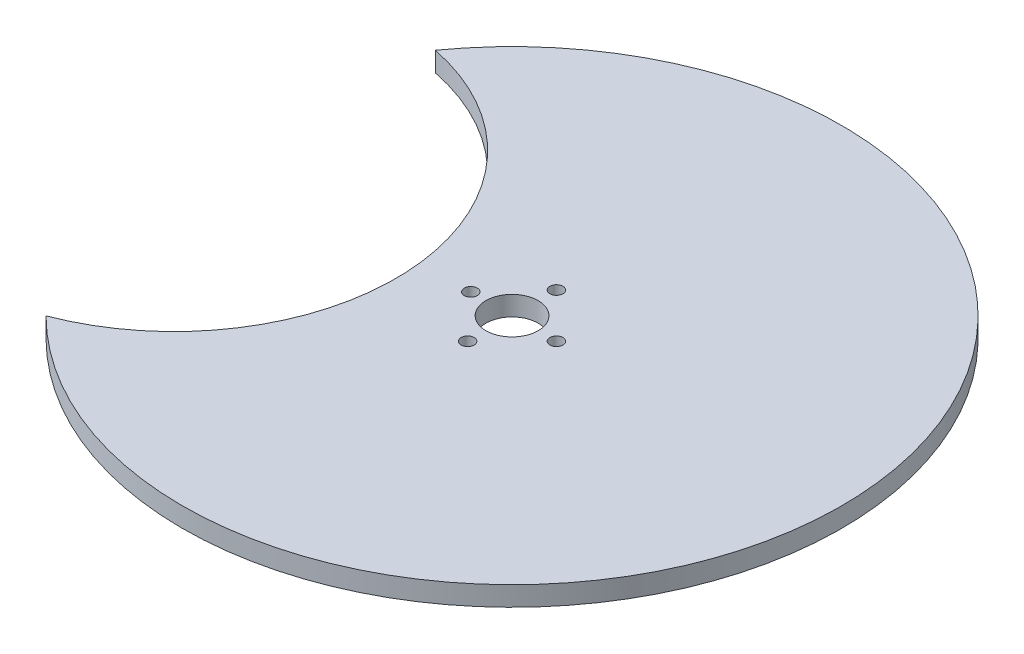
ISO-10303-21;
HEADER;
FILE_DESCRIPTION(('STEP AP214'),'2;1');
FILE_NAME('part.step','',(''),(''),'','','');
FILE_SCHEMA(('AUTOMOTIVE_DESIGN { 1 0 10303 214 1 1 1 1 }'));
ENDSEC;
DATA;
#1=APPLICATION_CONTEXT('core data for automotive mechanical design processes');
#2=APPLICATION_PROTOCOL_DEFINITION('international standard','automotive_design',2000,#1);
#3=PRODUCT_CONTEXT('',#1,'mechanical');
#4=PRODUCT('Part','Part','',(#3));
#5=PRODUCT_RELATED_PRODUCT_CATEGORY('part','',(#4));
#6=PRODUCT_DEFINITION_FORMATION('','',#4);
#7=PRODUCT_DEFINITION_CONTEXT('part definition',#1,'design');
#8=PRODUCT_DEFINITION('design','',#6,#7);
#9=PRODUCT_DEFINITION_SHAPE('','',#8);
#10=(LENGTH_UNIT() NAMED_UNIT(*) SI_UNIT(.MILLI.,.METRE.));
#11=(NAMED_UNIT(*) PLANE_ANGLE_UNIT() SI_UNIT($,.RADIAN.));
#12=(NAMED_UNIT(*) SI_UNIT($,.STERADIAN.) SOLID_ANGLE_UNIT());
#13=UNCERTAINTY_MEASURE_WITH_UNIT(LENGTH_MEASURE(1.E-05),#10,'distance_accuracy_value','');
#14=(GEOMETRIC_REPRESENTATION_CONTEXT(3) GLOBAL_UNCERTAINTY_ASSIGNED_CONTEXT((#13)) GLOBAL_UNIT_ASSIGNED_CONTEXT((#10,
#11,#12)) REPRESENTATION_CONTEXT('',''));
#15=CARTESIAN_POINT('',(0.,0.,0.));
#16=DIRECTION('',(0.,0.,1.));
#17=DIRECTION('',(1.,0.,0.));
#18=AXIS2_PLACEMENT_3D('',#15,#16,#17);
#19=CARTESIAN_POINT('',(-23.9171069469538,3.,1.99298652478539));
#20=DIRECTION('',(0.,1.,0.));
#21=DIRECTION('',(0.,0.,1.));
#22=AXIS2_PLACEMENT_3D('',#19,#20,#21);
#23=PLANE('',#22);
#24=CARTESIAN_POINT('',(6.8,3.,0.));
#25=DIRECTION('',(0.,1.,0.));
#26=DIRECTION('',(0.,0.,1.));
#27=AXIS2_PLACEMENT_3D('',#24,#25,#26);
#28=CIRCLE('',#27,1.);
#29=CARTESIAN_POINT('',(6.8,3.,1.));
#30=VERTEX_POINT('',#29);
#31=EDGE_CURVE('E90',#30,#30,#28,.T.);
#32=ORIENTED_EDGE('',*,*,#31,.F.);
#33=EDGE_LOOP('',(#32));
#34=FACE_BOUND('',#33,.T.);
#35=CARTESIAN_POINT('',(-6.31848424174564,3.,0.));
#36=DIRECTION('',(0.,1.,0.));
#37=DIRECTION('',(0.,0.,1.));
#38=AXIS2_PLACEMENT_3D('',#35,#36,#37);
#39=CIRCLE('',#38,1.);
#40=CARTESIAN_POINT('',(-6.31848424174564,3.,1.));
#41=VERTEX_POINT('',#40);
#42=EDGE_CURVE('E79',#41,#41,#39,.T.);
#43=ORIENTED_EDGE('',*,*,#42,.F.);
#44=EDGE_LOOP('',(#43));
#45=FACE_BOUND('',#44,.T.);
#46=CARTESIAN_POINT('',(-47.8342138939075,3.,3.98597304957078));
#47=DIRECTION('',(0.,-1.,0.));
#48=DIRECTION('',(0.,0.,1.));
#49=AXIS2_PLACEMENT_3D('',#46,#47,#48);
#50=CIRCLE('',#49,34.);
#51=CARTESIAN_POINT('',(-41.1018934177725,3.,-29.3408308927009));
#52=VERTEX_POINT('',#51);
#53=CARTESIAN_POINT('',(-35.6788711365433,3.,35.7388885448602));
#54=VERTEX_POINT('',#53);
#55=EDGE_CURVE('E64',#52,#54,#50,.T.);
#56=ORIENTED_EDGE('',*,*,#55,.T.);
#57=CARTESIAN_POINT('',(0.,3.,0.));
#58=DIRECTION('',(0.,1.,0.));
#59=DIRECTION('',(0.,0.,1.));
#60=AXIS2_PLACEMENT_3D('',#57,#58,#59);
#61=CIRCLE('',#60,50.5);
#62=EDGE_CURVE('E49',#54,#52,#61,.T.);
#63=ORIENTED_EDGE('',*,*,#62,.T.);
#64=EDGE_LOOP('',(#56,#63));
#65=FACE_BOUND('',#64,.T.);
#66=CARTESIAN_POINT('',(0.,3.,0.));
#67=DIRECTION('',(0.,1.,0.));
#68=DIRECTION('',(0.,0.,1.));
#69=AXIS2_PLACEMENT_3D('',#66,#67,#68);
#70=CIRCLE('',#69,4.);
#71=CARTESIAN_POINT('',(0.,3.,4.));
#72=VERTEX_POINT('',#71);
#73=EDGE_CURVE('E70',#72,#72,#70,.T.);
#74=ORIENTED_EDGE('',*,*,#73,.F.);
#75=EDGE_LOOP('',(#74));
#76=FACE_BOUND('',#75,.T.);
#77=CARTESIAN_POINT('',(0.,3.,-6.8));
#78=DIRECTION('',(0.,1.,0.));
#79=DIRECTION('',(0.,0.,1.));
#80=AXIS2_PLACEMENT_3D('',#77,#78,#79);
#81=CIRCLE('',#80,1.);
#82=CARTESIAN_POINT('',(0.,3.,-5.8));
#83=VERTEX_POINT('',#82);
#84=EDGE_CURVE('E84',#83,#83,#81,.T.);
#85=ORIENTED_EDGE('',*,*,#84,.F.);
#86=EDGE_LOOP('',(#85));
#87=FACE_BOUND('',#86,.T.);
#88=CARTESIAN_POINT('',(0.,3.,6.8));
#89=DIRECTION('',(0.,1.,0.));
#90=DIRECTION('',(0.,0.,1.));
#91=AXIS2_PLACEMENT_3D('',#88,#89,#90);
#92=CIRCLE('',#91,1.);
#93=CARTESIAN_POINT('',(0.,3.,7.8));
#94=VERTEX_POINT('',#93);
#95=EDGE_CURVE('E96',#94,#94,#92,.T.);
#96=ORIENTED_EDGE('',*,*,#95,.F.);
#97=EDGE_LOOP('',(#96));
#98=FACE_BOUND('',#97,.T.);
#99=ADVANCED_FACE('F33',(#34,#45,#65,#76,#87,#98),#23,.T.);
#100=CARTESIAN_POINT('',(-23.9171069469538,0.,1.99298652478539));
#101=DIRECTION('',(0.,1.,0.));
#102=DIRECTION('',(0.,0.,1.));
#103=AXIS2_PLACEMENT_3D('',#100,#101,#102);
#104=PLANE('',#103);
#105=CARTESIAN_POINT('',(-47.8342138939075,0.,3.98597304957078));
#106=DIRECTION('',(0.,-1.,0.));
#107=DIRECTION('',(0.,0.,1.));
#108=AXIS2_PLACEMENT_3D('',#105,#106,#107);
#109=CIRCLE('',#108,34.);
#110=CARTESIAN_POINT('',(-41.1018934177725,0.,-29.3408308927009));
#111=VERTEX_POINT('',#110);
#112=CARTESIAN_POINT('',(-35.6788711365433,0.,35.7388885448602));
#113=VERTEX_POINT('',#112);
#114=EDGE_CURVE('E65',#111,#113,#109,.T.);
#115=ORIENTED_EDGE('',*,*,#114,.F.);
#116=CARTESIAN_POINT('',(0.,0.,0.));
#117=DIRECTION('',(0.,1.,0.));
#118=DIRECTION('',(0.,0.,1.));
#119=AXIS2_PLACEMENT_3D('',#116,#117,#118);
#120=CIRCLE('',#119,50.5);
#121=EDGE_CURVE('E57',#113,#111,#120,.T.);
#122=ORIENTED_EDGE('',*,*,#121,.F.);
#123=EDGE_LOOP('',(#115,#122));
#124=FACE_BOUND('',#123,.T.);
#125=CARTESIAN_POINT('',(0.,0.,0.));
#126=DIRECTION('',(0.,1.,0.));
#127=DIRECTION('',(0.,0.,1.));
#128=AXIS2_PLACEMENT_3D('',#125,#126,#127);
#129=CIRCLE('',#128,4.);
#130=CARTESIAN_POINT('',(0.,0.,4.));
#131=VERTEX_POINT('',#130);
#132=EDGE_CURVE('E73',#131,#131,#129,.T.);
#133=ORIENTED_EDGE('',*,*,#132,.T.);
#134=EDGE_LOOP('',(#133));
#135=FACE_BOUND('',#134,.T.);
#136=CARTESIAN_POINT('',(-6.31848424174564,0.,0.));
#137=DIRECTION('',(0.,1.,0.));
#138=DIRECTION('',(0.,0.,1.));
#139=AXIS2_PLACEMENT_3D('',#136,#137,#138);
#140=CIRCLE('',#139,1.);
#141=CARTESIAN_POINT('',(-6.31848424174564,0.,1.));
#142=VERTEX_POINT('',#141);
#143=EDGE_CURVE('E81',#142,#142,#140,.T.);
#144=ORIENTED_EDGE('',*,*,#143,.T.);
#145=EDGE_LOOP('',(#144));
#146=FACE_BOUND('',#145,.T.);
#147=CARTESIAN_POINT('',(0.,0.,-6.8));
#148=DIRECTION('',(0.,1.,0.));
#149=DIRECTION('',(0.,0.,1.));
#150=AXIS2_PLACEMENT_3D('',#147,#148,#149);
#151=CIRCLE('',#150,1.);
#152=CARTESIAN_POINT('',(0.,0.,-5.8));
#153=VERTEX_POINT('',#152);
#154=EDGE_CURVE('E87',#153,#153,#151,.T.);
#155=ORIENTED_EDGE('',*,*,#154,.T.);
#156=EDGE_LOOP('',(#155));
#157=FACE_BOUND('',#156,.T.);
#158=CARTESIAN_POINT('',(6.8,0.,0.));
#159=DIRECTION('',(0.,1.,0.));
#160=DIRECTION('',(0.,0.,1.));
#161=AXIS2_PLACEMENT_3D('',#158,#159,#160);
#162=CIRCLE('',#161,1.);
#163=CARTESIAN_POINT('',(6.8,0.,1.));
#164=VERTEX_POINT('',#163);
#165=EDGE_CURVE('E93',#164,#164,#162,.T.);
#166=ORIENTED_EDGE('',*,*,#165,.T.);
#167=EDGE_LOOP('',(#166));
#168=FACE_BOUND('',#167,.T.);
#169=CARTESIAN_POINT('',(0.,0.,6.8));
#170=DIRECTION('',(0.,1.,0.));
#171=DIRECTION('',(0.,0.,1.));
#172=AXIS2_PLACEMENT_3D('',#169,#170,#171);
#173=CIRCLE('',#172,1.);
#174=CARTESIAN_POINT('',(0.,0.,7.8));
#175=VERTEX_POINT('',#174);
#176=EDGE_CURVE('E99',#175,#175,#173,.T.);
#177=ORIENTED_EDGE('',*,*,#176,.T.);
#178=EDGE_LOOP('',(#177));
#179=FACE_BOUND('',#178,.T.);
#180=ADVANCED_FACE('F68',(#124,#135,#146,#157,#168,#179),#104,.F.);
#181=CARTESIAN_POINT('',(-47.8342138939075,3.,3.98597304957078));
#182=DIRECTION('',(0.,-1.,0.));
#183=DIRECTION('',(0.,0.,-1.));
#184=AXIS2_PLACEMENT_3D('',#181,#182,#183);
#185=CYLINDRICAL_SURFACE('',#184,34.);
#186=ORIENTED_EDGE('',*,*,#114,.T.);
#187=DIRECTION('',(0.,-1.,0.));
#188=VECTOR('',#187,1.);
#189=CARTESIAN_POINT('',(-35.6788711365433,3.,35.7388885448602));
#190=LINE('',#189,#188);
#191=EDGE_CURVE('E11',#54,#113,#190,.T.);
#192=ORIENTED_EDGE('',*,*,#191,.F.);
#193=ORIENTED_EDGE('',*,*,#55,.F.);
#194=DIRECTION('',(0.,-1.,0.));
#195=VECTOR('',#194,1.);
#196=CARTESIAN_POINT('',(-41.1018934177725,3.,-29.3408308927009));
#197=LINE('',#196,#195);
#198=EDGE_CURVE('E42',#52,#111,#197,.T.);
#199=ORIENTED_EDGE('',*,*,#198,.T.);
#200=EDGE_LOOP('',(#186,#192,#193,#199));
#201=FACE_BOUND('',#200,.T.);
#202=ADVANCED_FACE('F35',(#201),#185,.F.);
#203=CARTESIAN_POINT('',(0.,3.,0.));
#204=DIRECTION('',(0.,-1.,0.));
#205=DIRECTION('',(0.,0.,-1.));
#206=AXIS2_PLACEMENT_3D('',#203,#204,#205);
#207=CYLINDRICAL_SURFACE('',#206,50.5);
#208=ORIENTED_EDGE('',*,*,#121,.T.);
#209=ORIENTED_EDGE('',*,*,#198,.F.);
#210=ORIENTED_EDGE('',*,*,#62,.F.);
#211=ORIENTED_EDGE('',*,*,#191,.T.);
#212=EDGE_LOOP('',(#208,#209,#210,#211));
#213=FACE_BOUND('',#212,.T.);
#214=ADVANCED_FACE('F60',(#213),#207,.T.);
#215=CARTESIAN_POINT('',(0.,3.,0.));
#216=DIRECTION('',(0.,-1.,0.));
#217=DIRECTION('',(0.,0.,-1.));
#218=AXIS2_PLACEMENT_3D('',#215,#216,#217);
#219=CYLINDRICAL_SURFACE('',#218,4.);
#220=ORIENTED_EDGE('',*,*,#73,.T.);
#221=EDGE_LOOP('',(#220));
#222=FACE_BOUND('',#221,.T.);
#223=ORIENTED_EDGE('',*,*,#132,.F.);
#224=EDGE_LOOP('',(#223));
#225=FACE_BOUND('',#224,.T.);
#226=ADVANCED_FACE('F118',(#222,#225),#219,.F.);
#227=CARTESIAN_POINT('',(-6.31848424174564,3.,0.));
#228=DIRECTION('',(0.,-1.,0.));
#229=DIRECTION('',(0.,0.,-1.));
#230=AXIS2_PLACEMENT_3D('',#227,#228,#229);
#231=CYLINDRICAL_SURFACE('',#230,1.);
#232=ORIENTED_EDGE('',*,*,#42,.T.);
#233=EDGE_LOOP('',(#232));
#234=FACE_BOUND('',#233,.T.);
#235=ORIENTED_EDGE('',*,*,#143,.F.);
#236=EDGE_LOOP('',(#235));
#237=FACE_BOUND('',#236,.T.);
#238=ADVANCED_FACE('F125',(#234,#237),#231,.F.);
#239=CARTESIAN_POINT('',(0.,3.,-6.8));
#240=DIRECTION('',(0.,-1.,0.));
#241=DIRECTION('',(0.,0.,-1.));
#242=AXIS2_PLACEMENT_3D('',#239,#240,#241);
#243=CYLINDRICAL_SURFACE('',#242,1.);
#244=ORIENTED_EDGE('',*,*,#84,.T.);
#245=EDGE_LOOP('',(#244));
#246=FACE_BOUND('',#245,.T.);
#247=ORIENTED_EDGE('',*,*,#154,.F.);
#248=EDGE_LOOP('',(#247));
#249=FACE_BOUND('',#248,.T.);
#250=ADVANCED_FACE('F158',(#246,#249),#243,.F.);
#251=CARTESIAN_POINT('',(6.8,3.,0.));
#252=DIRECTION('',(0.,-1.,0.));
#253=DIRECTION('',(0.,0.,-1.));
#254=AXIS2_PLACEMENT_3D('',#251,#252,#253);
#255=CYLINDRICAL_SURFACE('',#254,1.);
#256=ORIENTED_EDGE('',*,*,#31,.T.);
#257=EDGE_LOOP('',(#256));
#258=FACE_BOUND('',#257,.T.);
#259=ORIENTED_EDGE('',*,*,#165,.F.);
#260=EDGE_LOOP('',(#259));
#261=FACE_BOUND('',#260,.T.);
#262=ADVANCED_FACE('F166',(#258,#261),#255,.F.);
#263=CARTESIAN_POINT('',(0.,3.,6.8));
#264=DIRECTION('',(0.,-1.,0.));
#265=DIRECTION('',(0.,0.,-1.));
#266=AXIS2_PLACEMENT_3D('',#263,#264,#265);
#267=CYLINDRICAL_SURFACE('',#266,1.);
#268=ORIENTED_EDGE('',*,*,#95,.T.);
#269=EDGE_LOOP('',(#268));
#270=FACE_BOUND('',#269,.T.);
#271=ORIENTED_EDGE('',*,*,#176,.F.);
#272=EDGE_LOOP('',(#271));
#273=FACE_BOUND('',#272,.T.);
#274=ADVANCED_FACE('F105',(#270,#273),#267,.F.);
#275=CLOSED_SHELL('',(#99,#180,#202,#214,#226,#238,#250,#262,#274));
#276=MANIFOLD_SOLID_BREP('B2',#275);
#277=ADVANCED_BREP_SHAPE_REPRESENTATION('',(#18,#276),#14);
#278=SHAPE_DEFINITION_REPRESENTATION(#9,#277);
ENDSEC;
END-ISO-10303-21;
